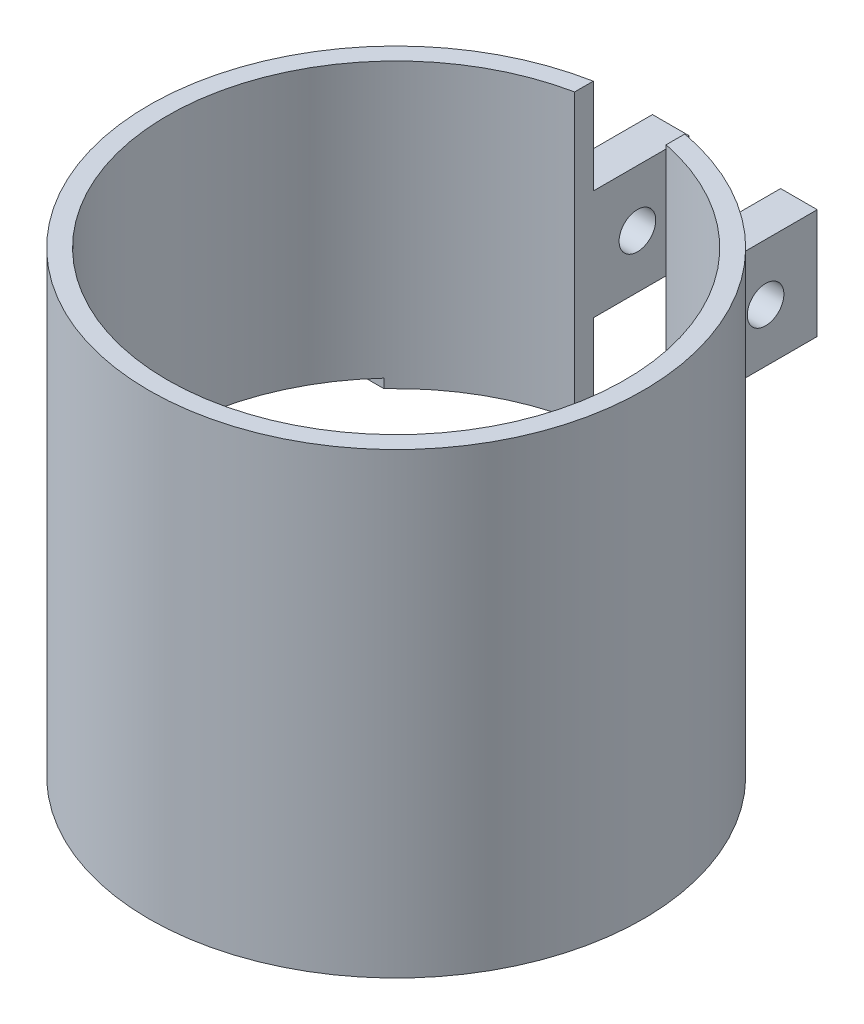
ISO-10303-21;
HEADER;
FILE_DESCRIPTION(('STEP AP214'),'2;1');
FILE_NAME('part.step','',(''),(''),'','','');
FILE_SCHEMA(('AUTOMOTIVE_DESIGN { 1 0 10303 214 1 1 1 1 }'));
ENDSEC;
DATA;
#1=APPLICATION_CONTEXT('core data for automotive mechanical design processes');
#2=APPLICATION_PROTOCOL_DEFINITION('international standard','automotive_design',2000,#1);
#3=PRODUCT_CONTEXT('',#1,'mechanical');
#4=PRODUCT('Part','Part','',(#3));
#5=PRODUCT_RELATED_PRODUCT_CATEGORY('part','',(#4));
#6=PRODUCT_DEFINITION_FORMATION('','',#4);
#7=PRODUCT_DEFINITION_CONTEXT('part definition',#1,'design');
#8=PRODUCT_DEFINITION('design','',#6,#7);
#9=PRODUCT_DEFINITION_SHAPE('','',#8);
#10=(LENGTH_UNIT() NAMED_UNIT(*) SI_UNIT(.MILLI.,.METRE.));
#11=(NAMED_UNIT(*) PLANE_ANGLE_UNIT() SI_UNIT($,.RADIAN.));
#12=(NAMED_UNIT(*) SI_UNIT($,.STERADIAN.) SOLID_ANGLE_UNIT());
#13=UNCERTAINTY_MEASURE_WITH_UNIT(LENGTH_MEASURE(1.E-05),#10,'distance_accuracy_value','');
#14=(GEOMETRIC_REPRESENTATION_CONTEXT(3) GLOBAL_UNCERTAINTY_ASSIGNED_CONTEXT((#13)) GLOBAL_UNIT_ASSIGNED_CONTEXT((#10,
#11,#12)) REPRESENTATION_CONTEXT('',''));
#15=CARTESIAN_POINT('',(0.,0.,0.));
#16=DIRECTION('',(0.,0.,1.));
#17=DIRECTION('',(1.,0.,0.));
#18=AXIS2_PLACEMENT_3D('',#15,#16,#17);
#19=CARTESIAN_POINT('',(0.,25.,0.));
#20=DIRECTION('',(0.,-1.,0.));
#21=DIRECTION('',(0.,0.,-1.));
#22=AXIS2_PLACEMENT_3D('',#19,#20,#21);
#23=CYLINDRICAL_SURFACE('',#22,13.5);
#24=CARTESIAN_POINT('',(0.,0.,0.));
#25=DIRECTION('',(0.,1.,0.));
#26=DIRECTION('',(0.,0.,1.));
#27=AXIS2_PLACEMENT_3D('',#24,#25,#26);
#28=CIRCLE('',#27,13.5);
#29=CARTESIAN_POINT('',(0.,0.,13.5));
#30=VERTEX_POINT('',#29);
#31=EDGE_CURVE('E283',#30,#30,#28,.T.);
#32=ORIENTED_EDGE('',*,*,#31,.T.);
#33=EDGE_LOOP('',(#32));
#34=FACE_BOUND('',#33,.T.);
#35=CARTESIAN_POINT('',(0.,19.8029275901374,0.));
#36=DIRECTION('',(0.,-1.,0.));
#37=DIRECTION('',(0.,0.,-1.));
#38=AXIS2_PLACEMENT_3D('',#35,#36,#37);
#39=CIRCLE('',#38,13.5);
#40=CARTESIAN_POINT('',(2.5,19.8029275901374,-13.2664991614216));
#41=VERTEX_POINT('',#40);
#42=CARTESIAN_POINT('',(4.5,19.8029275901374,-12.7279220613579));
#43=VERTEX_POINT('',#42);
#44=EDGE_CURVE('E52',#41,#43,#39,.T.);
#45=ORIENTED_EDGE('',*,*,#44,.F.);
#46=DIRECTION('',(0.,-1.,0.));
#47=VECTOR('',#46,1.);
#48=CARTESIAN_POINT('',(2.5,25.,-13.2664991614216));
#49=LINE('',#48,#47);
#50=CARTESIAN_POINT('',(2.50000000000001,25.,-13.2664991614216));
#51=VERTEX_POINT('',#50);
#52=EDGE_CURVE('E163',#41,#51,#49,.F.);
#53=ORIENTED_EDGE('',*,*,#52,.T.);
#54=CARTESIAN_POINT('',(0.,25.,0.));
#55=DIRECTION('',(0.,1.,0.));
#56=DIRECTION('',(0.,0.,1.));
#57=AXIS2_PLACEMENT_3D('',#54,#55,#56);
#58=CIRCLE('',#57,13.5);
#59=CARTESIAN_POINT('',(-2.49999999999999,25.,-13.2664991614216));
#60=VERTEX_POINT('',#59);
#61=EDGE_CURVE('E286',#60,#51,#58,.T.);
#62=ORIENTED_EDGE('',*,*,#61,.F.);
#63=DIRECTION('',(0.,-1.,0.));
#64=VECTOR('',#63,1.);
#65=CARTESIAN_POINT('',(-2.49999999999999,25.,-13.2664991614216));
#66=LINE('',#65,#64);
#67=CARTESIAN_POINT('',(-2.49999999999999,19.8029275901374,-13.2664991614216));
#68=VERTEX_POINT('',#67);
#69=EDGE_CURVE('E254',#60,#68,#66,.T.);
#70=ORIENTED_EDGE('',*,*,#69,.T.);
#71=CARTESIAN_POINT('',(0.,19.8029275901374,0.));
#72=DIRECTION('',(0.,1.,0.));
#73=DIRECTION('',(0.,0.,1.));
#74=AXIS2_PLACEMENT_3D('',#71,#72,#73);
#75=CIRCLE('',#74,13.5);
#76=CARTESIAN_POINT('',(-4.5,19.8029275901374,-12.7279220613579));
#77=VERTEX_POINT('',#76);
#78=EDGE_CURVE('E217',#68,#77,#75,.T.);
#79=ORIENTED_EDGE('',*,*,#78,.T.);
#80=DIRECTION('',(0.,-1.,0.));
#81=VECTOR('',#80,1.);
#82=CARTESIAN_POINT('',(-4.5,25.,-12.7279220613579));
#83=LINE('',#82,#81);
#84=CARTESIAN_POINT('',(-4.5,13.8029275901374,-12.7279220613579));
#85=VERTEX_POINT('',#84);
#86=EDGE_CURVE('E227',#77,#85,#83,.T.);
#87=ORIENTED_EDGE('',*,*,#86,.T.);
#88=CARTESIAN_POINT('',(0.,13.8029275901374,0.));
#89=DIRECTION('',(0.,-1.,0.));
#90=DIRECTION('',(0.,0.,-1.));
#91=AXIS2_PLACEMENT_3D('',#88,#89,#90);
#92=CIRCLE('',#91,13.5);
#93=CARTESIAN_POINT('',(-2.5,13.8029275901374,-13.2664991614216));
#94=VERTEX_POINT('',#93);
#95=EDGE_CURVE('E224',#85,#94,#92,.T.);
#96=ORIENTED_EDGE('',*,*,#95,.T.);
#97=CARTESIAN_POINT('',(-2.5,9.5,-13.2664991614216));
#98=VERTEX_POINT('',#97);
#99=EDGE_CURVE('E253',#94,#98,#66,.T.);
#100=ORIENTED_EDGE('',*,*,#99,.T.);
#101=CARTESIAN_POINT('',(0.,9.5,0.));
#102=DIRECTION('',(0.,1.,0.));
#103=DIRECTION('',(-1.,0.,0.));
#104=AXIS2_PLACEMENT_3D('',#101,#102,#103);
#105=CIRCLE('',#104,13.5);
#106=CARTESIAN_POINT('',(-10.4880884817015,9.5,-8.50000000000001));
#107=VERTEX_POINT('',#106);
#108=EDGE_CURVE('E248',#98,#107,#105,.T.);
#109=ORIENTED_EDGE('',*,*,#108,.T.);
#110=DIRECTION('',(0.,-1.,0.));
#111=VECTOR('',#110,1.);
#112=CARTESIAN_POINT('',(-10.4880884817015,25.,-8.50000000000001));
#113=LINE('',#112,#111);
#114=CARTESIAN_POINT('',(-10.4880884817015,10.,-8.50000000000001));
#115=VERTEX_POINT('',#114);
#116=EDGE_CURVE('E270',#107,#115,#113,.F.);
#117=ORIENTED_EDGE('',*,*,#116,.T.);
#118=CARTESIAN_POINT('',(0.,10.,0.));
#119=DIRECTION('',(0.,1.,0.));
#120=DIRECTION('',(0.,0.,1.));
#121=AXIS2_PLACEMENT_3D('',#118,#119,#120);
#122=CIRCLE('',#121,13.5);
#123=CARTESIAN_POINT('',(-10.4880884817015,10.,8.5));
#124=VERTEX_POINT('',#123);
#125=EDGE_CURVE('E260',#115,#124,#122,.T.);
#126=ORIENTED_EDGE('',*,*,#125,.T.);
#127=DIRECTION('',(0.,-1.,0.));
#128=VECTOR('',#127,1.);
#129=CARTESIAN_POINT('',(-10.4880884817015,25.,8.5));
#130=LINE('',#129,#128);
#131=CARTESIAN_POINT('',(-10.4880884817015,2.,8.5));
#132=VERTEX_POINT('',#131);
#133=EDGE_CURVE('E276',#124,#132,#130,.T.);
#134=ORIENTED_EDGE('',*,*,#133,.T.);
#135=CARTESIAN_POINT('',(0.,2.,0.));
#136=DIRECTION('',(0.,-1.,0.));
#137=DIRECTION('',(0.,0.,-1.));
#138=AXIS2_PLACEMENT_3D('',#135,#136,#137);
#139=CIRCLE('',#138,13.5);
#140=CARTESIAN_POINT('',(-10.4880884817015,2.,-8.5));
#141=VERTEX_POINT('',#140);
#142=EDGE_CURVE('E274',#132,#141,#139,.T.);
#143=ORIENTED_EDGE('',*,*,#142,.T.);
#144=CARTESIAN_POINT('',(-10.4880884817015,6.5,-8.50000000000001));
#145=VERTEX_POINT('',#144);
#146=EDGE_CURVE('E271',#141,#145,#113,.F.);
#147=ORIENTED_EDGE('',*,*,#146,.T.);
#148=CARTESIAN_POINT('',(0.,6.5,0.));
#149=DIRECTION('',(0.,-1.,0.));
#150=DIRECTION('',(1.,0.,0.));
#151=AXIS2_PLACEMENT_3D('',#148,#149,#150);
#152=CIRCLE('',#151,13.5);
#153=CARTESIAN_POINT('',(2.5,6.5,-13.2664991614216));
#154=VERTEX_POINT('',#153);
#155=EDGE_CURVE('E243',#145,#154,#152,.T.);
#156=ORIENTED_EDGE('',*,*,#155,.T.);
#157=CARTESIAN_POINT('',(2.5,13.8029275901374,-13.2664991614216));
#158=VERTEX_POINT('',#157);
#159=EDGE_CURVE('E251',#154,#158,#49,.F.);
#160=ORIENTED_EDGE('',*,*,#159,.T.);
#161=CARTESIAN_POINT('',(0.,13.8029275901374,0.));
#162=DIRECTION('',(0.,1.,0.));
#163=DIRECTION('',(0.,0.,1.));
#164=AXIS2_PLACEMENT_3D('',#161,#162,#163);
#165=CIRCLE('',#164,13.5);
#166=CARTESIAN_POINT('',(4.5,13.8029275901374,-12.7279220613579));
#167=VERTEX_POINT('',#166);
#168=EDGE_CURVE('E190',#167,#158,#165,.T.);
#169=ORIENTED_EDGE('',*,*,#168,.F.);
#170=DIRECTION('',(0.,-1.,0.));
#171=VECTOR('',#170,1.);
#172=CARTESIAN_POINT('',(4.5,25.,-12.7279220613579));
#173=LINE('',#172,#171);
#174=EDGE_CURVE('E48',#43,#167,#173,.T.);
#175=ORIENTED_EDGE('',*,*,#174,.F.);
#176=EDGE_LOOP('',(#45,#53,#62,#70,#79,#87,#96,#100,#109,#117,#126,#134,#143,#147,#156,#160,
#169,#175));
#177=FACE_BOUND('',#176,.T.);
#178=ADVANCED_FACE('F34',(#34,#177),#23,.T.);
#179=CARTESIAN_POINT('',(-4.50000000000001,2.,-8.5));
#180=DIRECTION('',(0.,0.,-1.));
#181=DIRECTION('',(0.,1.,0.));
#182=AXIS2_PLACEMENT_3D('',#179,#180,#181);
#183=PLANE('',#182);
#184=ORIENTED_EDGE('',*,*,#116,.F.);
#185=DIRECTION('',(1.,0.,0.));
#186=VECTOR('',#185,1.);
#187=CARTESIAN_POINT('',(-4.50000000000001,9.5,-8.50000000000001));
#188=LINE('',#187,#186);
#189=CARTESIAN_POINT('',(-9.16515138991168,9.5,-8.5));
#190=VERTEX_POINT('',#189);
#191=EDGE_CURVE('E307',#107,#190,#188,.T.);
#192=ORIENTED_EDGE('',*,*,#191,.T.);
#193=DIRECTION('',(0.,1.,0.));
#194=VECTOR('',#193,1.);
#195=CARTESIAN_POINT('',(-9.16515138991168,0.999999999999999,-8.5));
#196=LINE('',#195,#194);
#197=CARTESIAN_POINT('',(-9.16515138991168,10.,-8.50000000000001));
#198=VERTEX_POINT('',#197);
#199=EDGE_CURVE('E295',#198,#190,#196,.F.);
#200=ORIENTED_EDGE('',*,*,#199,.F.);
#201=DIRECTION('',(-1.,0.,0.));
#202=VECTOR('',#201,1.);
#203=CARTESIAN_POINT('',(-4.50000000000001,10.,-8.50000000000001));
#204=LINE('',#203,#202);
#205=EDGE_CURVE('E264',#198,#115,#204,.T.);
#206=ORIENTED_EDGE('',*,*,#205,.T.);
#207=EDGE_LOOP('',(#184,#192,#200,#206));
#208=FACE_BOUND('',#207,.T.);
#209=ADVANCED_FACE('F339',(#208),#183,.F.);
#210=CARTESIAN_POINT('',(0.,25.,0.));
#211=DIRECTION('',(0.,1.,0.));
#212=DIRECTION('',(0.,0.,1.));
#213=AXIS2_PLACEMENT_3D('',#210,#211,#212);
#214=PLANE('',#213);
#215=DIRECTION('',(0.,0.,-1.));
#216=VECTOR('',#215,1.);
#217=CARTESIAN_POINT('',(-2.49999999999999,25.,-4.50000000000001));
#218=LINE('',#217,#216);
#219=CARTESIAN_POINT('',(-2.49999999999999,25.,-12.2474487139159));
#220=VERTEX_POINT('',#219);
#221=EDGE_CURVE('E229',#220,#60,#218,.T.);
#222=ORIENTED_EDGE('',*,*,#221,.T.);
#223=ORIENTED_EDGE('',*,*,#61,.T.);
#224=DIRECTION('',(0.,0.,-1.));
#225=VECTOR('',#224,1.);
#226=CARTESIAN_POINT('',(2.50000000000001,25.,-4.50000000000001));
#227=LINE('',#226,#225);
#228=CARTESIAN_POINT('',(2.50000000000001,25.,-12.2474487139159));
#229=VERTEX_POINT('',#228);
#230=EDGE_CURVE('E237',#229,#51,#227,.T.);
#231=ORIENTED_EDGE('',*,*,#230,.F.);
#232=CARTESIAN_POINT('',(0.,25.,0.));
#233=DIRECTION('',(0.,1.,0.));
#234=DIRECTION('',(0.,0.,1.));
#235=AXIS2_PLACEMENT_3D('',#232,#233,#234);
#236=CIRCLE('',#235,12.5);
#237=EDGE_CURVE('E279',#220,#229,#236,.T.);
#238=ORIENTED_EDGE('',*,*,#237,.F.);
#239=EDGE_LOOP('',(#222,#223,#231,#238));
#240=FACE_BOUND('',#239,.T.);
#241=ADVANCED_FACE('F344',(#240),#214,.T.);
#242=CARTESIAN_POINT('',(0.,0.,0.));
#243=DIRECTION('',(0.,1.,0.));
#244=DIRECTION('',(0.,0.,1.));
#245=AXIS2_PLACEMENT_3D('',#242,#243,#244);
#246=PLANE('',#245);
#247=ORIENTED_EDGE('',*,*,#31,.F.);
#248=EDGE_LOOP('',(#247));
#249=FACE_BOUND('',#248,.T.);
#250=ADVANCED_FACE('F350',(#249),#246,.F.);
#251=CARTESIAN_POINT('',(0.,1.,0.));
#252=DIRECTION('',(0.,1.,0.));
#253=DIRECTION('',(0.,0.,1.));
#254=AXIS2_PLACEMENT_3D('',#251,#252,#253);
#255=CYLINDRICAL_SURFACE('',#254,12.5);
#256=DIRECTION('',(0.,1.,0.));
#257=VECTOR('',#256,1.);
#258=CARTESIAN_POINT('',(2.5,1.,-12.2474487139159));
#259=LINE('',#258,#257);
#260=CARTESIAN_POINT('',(2.5,6.5,-12.2474487139159));
#261=VERTEX_POINT('',#260);
#262=EDGE_CURVE('E41',#229,#261,#259,.F.);
#263=ORIENTED_EDGE('',*,*,#262,.T.);
#264=CARTESIAN_POINT('',(0.,6.5,0.));
#265=DIRECTION('',(0.,-1.,0.));
#266=DIRECTION('',(1.,0.,0.));
#267=AXIS2_PLACEMENT_3D('',#264,#265,#266);
#268=CIRCLE('',#267,12.5);
#269=CARTESIAN_POINT('',(-9.16515138991168,6.5,-8.50000000000001));
#270=VERTEX_POINT('',#269);
#271=EDGE_CURVE('E233',#261,#270,#268,.F.);
#272=ORIENTED_EDGE('',*,*,#271,.T.);
#273=CARTESIAN_POINT('',(-9.16515138991168,2.,-8.5));
#274=VERTEX_POINT('',#273);
#275=EDGE_CURVE('E294',#270,#274,#196,.F.);
#276=ORIENTED_EDGE('',*,*,#275,.T.);
#277=CARTESIAN_POINT('',(0.,2.,0.));
#278=DIRECTION('',(0.,-1.,0.));
#279=DIRECTION('',(0.,0.,-1.));
#280=AXIS2_PLACEMENT_3D('',#277,#278,#279);
#281=CIRCLE('',#280,12.5);
#282=CARTESIAN_POINT('',(-9.16515138991169,2.,8.5));
#283=VERTEX_POINT('',#282);
#284=EDGE_CURVE('E298',#274,#283,#281,.F.);
#285=ORIENTED_EDGE('',*,*,#284,.T.);
#286=DIRECTION('',(0.,1.,0.));
#287=VECTOR('',#286,1.);
#288=CARTESIAN_POINT('',(-9.16515138991169,0.999999999999999,8.5));
#289=LINE('',#288,#287);
#290=CARTESIAN_POINT('',(-9.16515138991169,10.,8.5));
#291=VERTEX_POINT('',#290);
#292=EDGE_CURVE('E301',#283,#291,#289,.T.);
#293=ORIENTED_EDGE('',*,*,#292,.T.);
#294=CARTESIAN_POINT('',(0.,10.,0.));
#295=DIRECTION('',(0.,1.,0.));
#296=DIRECTION('',(0.,0.,1.));
#297=AXIS2_PLACEMENT_3D('',#294,#295,#296);
#298=CIRCLE('',#297,12.5);
#299=EDGE_CURVE('E289',#291,#198,#298,.F.);
#300=ORIENTED_EDGE('',*,*,#299,.T.);
#301=ORIENTED_EDGE('',*,*,#199,.T.);
#302=CARTESIAN_POINT('',(0.,9.5,0.));
#303=DIRECTION('',(0.,1.,0.));
#304=DIRECTION('',(-1.,0.,0.));
#305=AXIS2_PLACEMENT_3D('',#302,#303,#304);
#306=CIRCLE('',#305,12.5);
#307=CARTESIAN_POINT('',(-2.5,9.5,-12.2474487139159));
#308=VERTEX_POINT('',#307);
#309=EDGE_CURVE('E245',#190,#308,#306,.F.);
#310=ORIENTED_EDGE('',*,*,#309,.T.);
#311=DIRECTION('',(0.,1.,0.));
#312=VECTOR('',#311,1.);
#313=CARTESIAN_POINT('',(-2.5,1.,-12.2474487139159));
#314=LINE('',#313,#312);
#315=EDGE_CURVE('E11',#308,#220,#314,.T.);
#316=ORIENTED_EDGE('',*,*,#315,.T.);
#317=ORIENTED_EDGE('',*,*,#237,.T.);
#318=EDGE_LOOP('',(#263,#272,#276,#285,#293,#300,#301,#310,#316,#317));
#319=FACE_BOUND('',#318,.T.);
#320=CARTESIAN_POINT('',(0.,1.,0.));
#321=DIRECTION('',(0.,1.,0.));
#322=DIRECTION('',(0.,0.,1.));
#323=AXIS2_PLACEMENT_3D('',#320,#321,#322);
#324=CIRCLE('',#323,12.5);
#325=CARTESIAN_POINT('',(0.,1.,12.5));
#326=VERTEX_POINT('',#325);
#327=EDGE_CURVE('E280',#326,#326,#324,.T.);
#328=ORIENTED_EDGE('',*,*,#327,.F.);
#329=EDGE_LOOP('',(#328));
#330=FACE_BOUND('',#329,.T.);
#331=ADVANCED_FACE('F311',(#319,#330),#255,.F.);
#332=CARTESIAN_POINT('',(0.,1.,0.));
#333=DIRECTION('',(0.,1.,0.));
#334=DIRECTION('',(0.,0.,1.));
#335=AXIS2_PLACEMENT_3D('',#332,#333,#334);
#336=PLANE('',#335);
#337=ORIENTED_EDGE('',*,*,#327,.T.);
#338=EDGE_LOOP('',(#337));
#339=FACE_BOUND('',#338,.T.);
#340=ADVANCED_FACE('F356',(#339),#336,.T.);
#341=CARTESIAN_POINT('',(-4.50000000000001,2.,8.5));
#342=DIRECTION('',(0.,0.,1.));
#343=DIRECTION('',(0.,-1.,0.));
#344=AXIS2_PLACEMENT_3D('',#341,#342,#343);
#345=PLANE('',#344);
#346=DIRECTION('',(-1.,0.,0.));
#347=VECTOR('',#346,1.);
#348=CARTESIAN_POINT('',(-4.50000000000001,10.,8.5));
#349=LINE('',#348,#347);
#350=EDGE_CURVE('E256',#291,#124,#349,.T.);
#351=ORIENTED_EDGE('',*,*,#350,.F.);
#352=ORIENTED_EDGE('',*,*,#292,.F.);
#353=DIRECTION('',(-1.,0.,0.));
#354=VECTOR('',#353,1.);
#355=CARTESIAN_POINT('',(-4.50000000000001,2.,8.5));
#356=LINE('',#355,#354);
#357=EDGE_CURVE('E257',#283,#132,#356,.T.);
#358=ORIENTED_EDGE('',*,*,#357,.T.);
#359=ORIENTED_EDGE('',*,*,#133,.F.);
#360=EDGE_LOOP('',(#351,#352,#358,#359));
#361=FACE_BOUND('',#360,.T.);
#362=ADVANCED_FACE('F363',(#361),#345,.F.);
#363=CARTESIAN_POINT('',(-4.50000000000001,2.,-8.5));
#364=DIRECTION('',(0.,-1.,0.));
#365=DIRECTION('',(0.,0.,-1.));
#366=AXIS2_PLACEMENT_3D('',#363,#364,#365);
#367=PLANE('',#366);
#368=ORIENTED_EDGE('',*,*,#357,.F.);
#369=ORIENTED_EDGE('',*,*,#284,.F.);
#370=DIRECTION('',(-1.,0.,0.));
#371=VECTOR('',#370,1.);
#372=CARTESIAN_POINT('',(-4.50000000000001,2.,-8.5));
#373=LINE('',#372,#371);
#374=EDGE_CURVE('E261',#274,#141,#373,.T.);
#375=ORIENTED_EDGE('',*,*,#374,.T.);
#376=ORIENTED_EDGE('',*,*,#142,.F.);
#377=EDGE_LOOP('',(#368,#369,#375,#376));
#378=FACE_BOUND('',#377,.T.);
#379=ADVANCED_FACE('F367',(#378),#367,.F.);
#380=ORIENTED_EDGE('',*,*,#275,.F.);
#381=DIRECTION('',(-1.,0.,0.));
#382=VECTOR('',#381,1.);
#383=CARTESIAN_POINT('',(-4.50000000000001,6.5,-8.50000000000001));
#384=LINE('',#383,#382);
#385=EDGE_CURVE('E304',#270,#145,#384,.T.);
#386=ORIENTED_EDGE('',*,*,#385,.T.);
#387=ORIENTED_EDGE('',*,*,#146,.F.);
#388=ORIENTED_EDGE('',*,*,#374,.F.);
#389=EDGE_LOOP('',(#380,#386,#387,#388));
#390=FACE_BOUND('',#389,.T.);
#391=ADVANCED_FACE('F347',(#390),#183,.F.);
#392=CARTESIAN_POINT('',(-4.50000000000001,10.,-8.50000000000001));
#393=DIRECTION('',(0.,1.,0.));
#394=DIRECTION('',(0.,0.,1.));
#395=AXIS2_PLACEMENT_3D('',#392,#393,#394);
#396=PLANE('',#395);
#397=ORIENTED_EDGE('',*,*,#205,.F.);
#398=ORIENTED_EDGE('',*,*,#299,.F.);
#399=ORIENTED_EDGE('',*,*,#350,.T.);
#400=ORIENTED_EDGE('',*,*,#125,.F.);
#401=EDGE_LOOP('',(#397,#398,#399,#400));
#402=FACE_BOUND('',#401,.T.);
#403=ADVANCED_FACE('F369',(#402),#396,.F.);
#404=CARTESIAN_POINT('',(-10.5,6.5,-4.50000000000001));
#405=DIRECTION('',(0.,-1.,0.));
#406=DIRECTION('',(1.,0.,0.));
#407=AXIS2_PLACEMENT_3D('',#404,#405,#406);
#408=PLANE('',#407);
#409=ORIENTED_EDGE('',*,*,#155,.F.);
#410=ORIENTED_EDGE('',*,*,#385,.F.);
#411=ORIENTED_EDGE('',*,*,#271,.F.);
#412=DIRECTION('',(0.,0.,-1.));
#413=VECTOR('',#412,1.);
#414=CARTESIAN_POINT('',(2.5,6.5,-4.50000000000001));
#415=LINE('',#414,#413);
#416=EDGE_CURVE('E234',#261,#154,#415,.T.);
#417=ORIENTED_EDGE('',*,*,#416,.T.);
#418=EDGE_LOOP('',(#409,#410,#411,#417));
#419=FACE_BOUND('',#418,.T.);
#420=ADVANCED_FACE('F317',(#419),#408,.F.);
#421=CARTESIAN_POINT('',(2.5,9.5,-4.50000000000001));
#422=DIRECTION('',(1.,0.,0.));
#423=DIRECTION('',(0.,0.,-1.));
#424=AXIS2_PLACEMENT_3D('',#421,#422,#423);
#425=PLANE('',#424);
#426=CARTESIAN_POINT('',(2.5,16.7205559801136,-15.6779042610197));
#427=DIRECTION('',(1.,0.,0.));
#428=DIRECTION('',(0.,1.,0.));
#429=AXIS2_PLACEMENT_3D('',#426,#427,#428);
#430=CIRCLE('',#429,1.);
#431=CARTESIAN_POINT('',(2.5,17.7205559801136,-15.6779042610197));
#432=VERTEX_POINT('',#431);
#433=EDGE_CURVE('E421',#432,#432,#430,.T.);
#434=ORIENTED_EDGE('',*,*,#433,.T.);
#435=EDGE_LOOP('',(#434));
#436=FACE_BOUND('',#435,.T.);
#437=ORIENTED_EDGE('',*,*,#416,.F.);
#438=ORIENTED_EDGE('',*,*,#262,.F.);
#439=ORIENTED_EDGE('',*,*,#230,.T.);
#440=ORIENTED_EDGE('',*,*,#52,.F.);
#441=DIRECTION('',(0.,0.,-1.));
#442=VECTOR('',#441,1.);
#443=CARTESIAN_POINT('',(2.5,19.8029275901374,13.501));
#444=LINE('',#443,#442);
#445=CARTESIAN_POINT('',(2.5,19.8029275901374,-18.5));
#446=VERTEX_POINT('',#445);
#447=EDGE_CURVE('E155',#41,#446,#444,.T.);
#448=ORIENTED_EDGE('',*,*,#447,.T.);
#449=DIRECTION('',(0.,-1.,0.));
#450=VECTOR('',#449,1.);
#451=CARTESIAN_POINT('',(2.5,19.8029275901374,-18.5));
#452=LINE('',#451,#450);
#453=CARTESIAN_POINT('',(2.5,13.8029275901374,-18.5));
#454=VERTEX_POINT('',#453);
#455=EDGE_CURVE('E160',#446,#454,#452,.T.);
#456=ORIENTED_EDGE('',*,*,#455,.T.);
#457=DIRECTION('',(0.,0.,-1.));
#458=VECTOR('',#457,1.);
#459=CARTESIAN_POINT('',(2.5,13.8029275901374,13.501));
#460=LINE('',#459,#458);
#461=EDGE_CURVE('E186',#158,#454,#460,.T.);
#462=ORIENTED_EDGE('',*,*,#461,.F.);
#463=ORIENTED_EDGE('',*,*,#159,.F.);
#464=EDGE_LOOP('',(#437,#438,#439,#440,#448,#456,#462,#463));
#465=FACE_BOUND('',#464,.T.);
#466=ADVANCED_FACE('F158',(#436,#465),#425,.F.);
#467=CARTESIAN_POINT('',(-2.49999999999999,25.,-4.50000000000001));
#468=DIRECTION('',(-1.,0.,0.));
#469=DIRECTION('',(0.,-1.,0.));
#470=AXIS2_PLACEMENT_3D('',#467,#468,#469);
#471=PLANE('',#470);
#472=CARTESIAN_POINT('',(-2.5,16.7205559801136,-15.6779042610197));
#473=DIRECTION('',(1.,0.,0.));
#474=DIRECTION('',(0.,1.,0.));
#475=AXIS2_PLACEMENT_3D('',#472,#473,#474);
#476=CIRCLE('',#475,1.);
#477=CARTESIAN_POINT('',(-2.5,17.7205559801136,-15.6779042610197));
#478=VERTEX_POINT('',#477);
#479=EDGE_CURVE('E196',#478,#478,#476,.T.);
#480=ORIENTED_EDGE('',*,*,#479,.F.);
#481=EDGE_LOOP('',(#480));
#482=FACE_BOUND('',#481,.T.);
#483=ORIENTED_EDGE('',*,*,#221,.F.);
#484=ORIENTED_EDGE('',*,*,#315,.F.);
#485=DIRECTION('',(0.,0.,-1.));
#486=VECTOR('',#485,1.);
#487=CARTESIAN_POINT('',(-2.5,9.5,-4.50000000000001));
#488=LINE('',#487,#486);
#489=EDGE_CURVE('E230',#308,#98,#488,.T.);
#490=ORIENTED_EDGE('',*,*,#489,.T.);
#491=ORIENTED_EDGE('',*,*,#99,.F.);
#492=DIRECTION('',(0.,0.,-1.));
#493=VECTOR('',#492,1.);
#494=CARTESIAN_POINT('',(-2.5,13.8029275901374,13.501));
#495=LINE('',#494,#493);
#496=CARTESIAN_POINT('',(-2.5,13.8029275901374,-18.5));
#497=VERTEX_POINT('',#496);
#498=EDGE_CURVE('E214',#94,#497,#495,.T.);
#499=ORIENTED_EDGE('',*,*,#498,.T.);
#500=DIRECTION('',(0.,-1.,0.));
#501=VECTOR('',#500,1.);
#502=CARTESIAN_POINT('',(-2.5,19.8029275901374,-18.5));
#503=LINE('',#502,#501);
#504=CARTESIAN_POINT('',(-2.5,19.8029275901374,-18.5));
#505=VERTEX_POINT('',#504);
#506=EDGE_CURVE('E202',#505,#497,#503,.T.);
#507=ORIENTED_EDGE('',*,*,#506,.F.);
#508=DIRECTION('',(0.,0.,-1.));
#509=VECTOR('',#508,1.);
#510=CARTESIAN_POINT('',(-2.5,19.8029275901374,13.501));
#511=LINE('',#510,#509);
#512=EDGE_CURVE('E215',#68,#505,#511,.T.);
#513=ORIENTED_EDGE('',*,*,#512,.F.);
#514=ORIENTED_EDGE('',*,*,#69,.F.);
#515=EDGE_LOOP('',(#483,#484,#490,#491,#499,#507,#513,#514));
#516=FACE_BOUND('',#515,.T.);
#517=ADVANCED_FACE('F378',(#482,#516),#471,.F.);
#518=CARTESIAN_POINT('',(-10.5,9.5,-4.50000000000001));
#519=DIRECTION('',(0.,1.,0.));
#520=DIRECTION('',(-1.,0.,0.));
#521=AXIS2_PLACEMENT_3D('',#518,#519,#520);
#522=PLANE('',#521);
#523=ORIENTED_EDGE('',*,*,#489,.F.);
#524=ORIENTED_EDGE('',*,*,#309,.F.);
#525=ORIENTED_EDGE('',*,*,#191,.F.);
#526=ORIENTED_EDGE('',*,*,#108,.F.);
#527=EDGE_LOOP('',(#523,#524,#525,#526));
#528=FACE_BOUND('',#527,.T.);
#529=ADVANCED_FACE('F381',(#528),#522,.F.);
#530=CARTESIAN_POINT('',(-4.5,19.8029275901374,13.501));
#531=DIRECTION('',(-1.,0.,0.));
#532=DIRECTION('',(0.,0.,1.));
#533=AXIS2_PLACEMENT_3D('',#530,#531,#532);
#534=PLANE('',#533);
#535=CARTESIAN_POINT('',(-4.5,16.7205559801136,-15.6779042610197));
#536=DIRECTION('',(-1.,0.,0.));
#537=DIRECTION('',(0.,0.,1.));
#538=AXIS2_PLACEMENT_3D('',#535,#536,#537);
#539=CIRCLE('',#538,1.);
#540=CARTESIAN_POINT('',(-4.5,16.7205559801136,-14.6779042610197));
#541=VERTEX_POINT('',#540);
#542=EDGE_CURVE('E199',#541,#541,#539,.F.);
#543=ORIENTED_EDGE('',*,*,#542,.T.);
#544=EDGE_LOOP('',(#543));
#545=FACE_BOUND('',#544,.T.);
#546=ORIENTED_EDGE('',*,*,#86,.F.);
#547=DIRECTION('',(0.,0.,-1.));
#548=VECTOR('',#547,1.);
#549=CARTESIAN_POINT('',(-4.5,19.8029275901374,13.501));
#550=LINE('',#549,#548);
#551=CARTESIAN_POINT('',(-4.5,19.8029275901374,-18.5));
#552=VERTEX_POINT('',#551);
#553=EDGE_CURVE('E218',#77,#552,#550,.T.);
#554=ORIENTED_EDGE('',*,*,#553,.T.);
#555=DIRECTION('',(0.,1.,0.));
#556=VECTOR('',#555,1.);
#557=CARTESIAN_POINT('',(-4.5,19.8029275901374,-18.5));
#558=LINE('',#557,#556);
#559=CARTESIAN_POINT('',(-4.5,13.8029275901374,-18.5));
#560=VERTEX_POINT('',#559);
#561=EDGE_CURVE('E208',#560,#552,#558,.T.);
#562=ORIENTED_EDGE('',*,*,#561,.F.);
#563=DIRECTION('',(0.,0.,-1.));
#564=VECTOR('',#563,1.);
#565=CARTESIAN_POINT('',(-4.5,13.8029275901374,13.501));
#566=LINE('',#565,#564);
#567=EDGE_CURVE('E220',#85,#560,#566,.T.);
#568=ORIENTED_EDGE('',*,*,#567,.F.);
#569=EDGE_LOOP('',(#546,#554,#562,#568));
#570=FACE_BOUND('',#569,.T.);
#571=ADVANCED_FACE('F390',(#545,#570),#534,.T.);
#572=CARTESIAN_POINT('',(-4.5,13.8029275901374,13.501));
#573=DIRECTION('',(0.,-1.,0.));
#574=DIRECTION('',(0.,0.,-1.));
#575=AXIS2_PLACEMENT_3D('',#572,#573,#574);
#576=PLANE('',#575);
#577=ORIENTED_EDGE('',*,*,#95,.F.);
#578=ORIENTED_EDGE('',*,*,#567,.T.);
#579=DIRECTION('',(-1.,0.,0.));
#580=VECTOR('',#579,1.);
#581=CARTESIAN_POINT('',(-4.5,13.8029275901374,-18.5));
#582=LINE('',#581,#580);
#583=EDGE_CURVE('E205',#497,#560,#582,.T.);
#584=ORIENTED_EDGE('',*,*,#583,.F.);
#585=ORIENTED_EDGE('',*,*,#498,.F.);
#586=EDGE_LOOP('',(#577,#578,#584,#585));
#587=FACE_BOUND('',#586,.T.);
#588=ADVANCED_FACE('F392',(#587),#576,.T.);
#589=CARTESIAN_POINT('',(-4.5,19.8029275901374,13.501));
#590=DIRECTION('',(0.,1.,0.));
#591=DIRECTION('',(0.,0.,1.));
#592=AXIS2_PLACEMENT_3D('',#589,#590,#591);
#593=PLANE('',#592);
#594=ORIENTED_EDGE('',*,*,#78,.F.);
#595=ORIENTED_EDGE('',*,*,#512,.T.);
#596=DIRECTION('',(1.,0.,0.));
#597=VECTOR('',#596,1.);
#598=CARTESIAN_POINT('',(-4.5,19.8029275901374,-18.5));
#599=LINE('',#598,#597);
#600=EDGE_CURVE('E211',#552,#505,#599,.T.);
#601=ORIENTED_EDGE('',*,*,#600,.F.);
#602=ORIENTED_EDGE('',*,*,#553,.F.);
#603=EDGE_LOOP('',(#594,#595,#601,#602));
#604=FACE_BOUND('',#603,.T.);
#605=ADVANCED_FACE('F395',(#604),#593,.T.);
#606=CARTESIAN_POINT('',(0.,0.,-18.5));
#607=DIRECTION('',(0.,0.,1.));
#608=DIRECTION('',(1.,0.,0.));
#609=AXIS2_PLACEMENT_3D('',#606,#607,#608);
#610=PLANE('',#609);
#611=ORIENTED_EDGE('',*,*,#506,.T.);
#612=ORIENTED_EDGE('',*,*,#583,.T.);
#613=ORIENTED_EDGE('',*,*,#561,.T.);
#614=ORIENTED_EDGE('',*,*,#600,.T.);
#615=EDGE_LOOP('',(#611,#612,#613,#614));
#616=FACE_BOUND('',#615,.T.);
#617=ADVANCED_FACE('F333',(#616),#610,.F.);
#618=CARTESIAN_POINT('',(-7.32842712474619,16.7205559801136,-15.6779042610197));
#619=DIRECTION('',(1.,0.,0.));
#620=DIRECTION('',(0.,1.,0.));
#621=AXIS2_PLACEMENT_3D('',#618,#619,#620);
#622=CYLINDRICAL_SURFACE('',#621,1.);
#623=ORIENTED_EDGE('',*,*,#479,.T.);
#624=EDGE_LOOP('',(#623));
#625=FACE_BOUND('',#624,.T.);
#626=ORIENTED_EDGE('',*,*,#542,.F.);
#627=EDGE_LOOP('',(#626));
#628=FACE_BOUND('',#627,.T.);
#629=ADVANCED_FACE('F325',(#625,#628),#622,.F.);
#630=CARTESIAN_POINT('',(4.5,19.8029275901374,13.501));
#631=DIRECTION('',(-1.,0.,0.));
#632=DIRECTION('',(0.,0.,1.));
#633=AXIS2_PLACEMENT_3D('',#630,#631,#632);
#634=PLANE('',#633);
#635=CARTESIAN_POINT('',(4.5,16.7205559801136,-15.6779042610197));
#636=DIRECTION('',(1.,0.,0.));
#637=DIRECTION('',(0.,0.,-1.));
#638=AXIS2_PLACEMENT_3D('',#635,#636,#637);
#639=CIRCLE('',#638,1.);
#640=CARTESIAN_POINT('',(4.5,16.7205559801136,-16.6779042610197));
#641=VERTEX_POINT('',#640);
#642=EDGE_CURVE('E176',#641,#641,#639,.T.);
#643=ORIENTED_EDGE('',*,*,#642,.F.);
#644=EDGE_LOOP('',(#643));
#645=FACE_BOUND('',#644,.T.);
#646=DIRECTION('',(0.,0.,-1.));
#647=VECTOR('',#646,1.);
#648=CARTESIAN_POINT('',(4.5,19.8029275901374,13.501));
#649=LINE('',#648,#647);
#650=CARTESIAN_POINT('',(4.5,19.8029275901374,-18.5));
#651=VERTEX_POINT('',#650);
#652=EDGE_CURVE('E166',#43,#651,#649,.T.);
#653=ORIENTED_EDGE('',*,*,#652,.F.);
#654=ORIENTED_EDGE('',*,*,#174,.T.);
#655=DIRECTION('',(0.,0.,-1.));
#656=VECTOR('',#655,1.);
#657=CARTESIAN_POINT('',(4.5,13.8029275901374,13.501));
#658=LINE('',#657,#656);
#659=CARTESIAN_POINT('',(4.5,13.8029275901374,-18.5));
#660=VERTEX_POINT('',#659);
#661=EDGE_CURVE('E188',#167,#660,#658,.T.);
#662=ORIENTED_EDGE('',*,*,#661,.T.);
#663=DIRECTION('',(0.,1.,0.));
#664=VECTOR('',#663,1.);
#665=CARTESIAN_POINT('',(4.5,19.8029275901374,-18.5));
#666=LINE('',#665,#664);
#667=EDGE_CURVE('E180',#660,#651,#666,.T.);
#668=ORIENTED_EDGE('',*,*,#667,.T.);
#669=EDGE_LOOP('',(#653,#654,#662,#668));
#670=FACE_BOUND('',#669,.T.);
#671=ADVANCED_FACE('F323',(#645,#670),#634,.F.);
#672=CARTESIAN_POINT('',(4.5,19.8029275901374,13.501));
#673=DIRECTION('',(0.,-1.,0.));
#674=DIRECTION('',(0.,0.,-1.));
#675=AXIS2_PLACEMENT_3D('',#672,#673,#674);
#676=PLANE('',#675);
#677=ORIENTED_EDGE('',*,*,#447,.F.);
#678=ORIENTED_EDGE('',*,*,#44,.T.);
#679=ORIENTED_EDGE('',*,*,#652,.T.);
#680=DIRECTION('',(-1.,0.,0.));
#681=VECTOR('',#680,1.);
#682=CARTESIAN_POINT('',(4.5,19.8029275901374,-18.5));
#683=LINE('',#682,#681);
#684=EDGE_CURVE('E173',#651,#446,#683,.T.);
#685=ORIENTED_EDGE('',*,*,#684,.T.);
#686=EDGE_LOOP('',(#677,#678,#679,#685));
#687=FACE_BOUND('',#686,.T.);
#688=ADVANCED_FACE('F178',(#687),#676,.F.);
#689=CARTESIAN_POINT('',(4.5,13.8029275901374,13.501));
#690=DIRECTION('',(0.,1.,0.));
#691=DIRECTION('',(0.,0.,1.));
#692=AXIS2_PLACEMENT_3D('',#689,#690,#691);
#693=PLANE('',#692);
#694=ORIENTED_EDGE('',*,*,#661,.F.);
#695=ORIENTED_EDGE('',*,*,#168,.T.);
#696=ORIENTED_EDGE('',*,*,#461,.T.);
#697=DIRECTION('',(1.,0.,0.));
#698=VECTOR('',#697,1.);
#699=CARTESIAN_POINT('',(4.5,13.8029275901374,-18.5));
#700=LINE('',#699,#698);
#701=EDGE_CURVE('E167',#454,#660,#700,.T.);
#702=ORIENTED_EDGE('',*,*,#701,.T.);
#703=EDGE_LOOP('',(#694,#695,#696,#702));
#704=FACE_BOUND('',#703,.T.);
#705=ADVANCED_FACE('F321',(#704),#693,.F.);
#706=CARTESIAN_POINT('',(0.,0.,-18.5));
#707=DIRECTION('',(0.,0.,1.));
#708=DIRECTION('',(-1.,0.,0.));
#709=AXIS2_PLACEMENT_3D('',#706,#707,#708);
#710=PLANE('',#709);
#711=ORIENTED_EDGE('',*,*,#455,.F.);
#712=ORIENTED_EDGE('',*,*,#684,.F.);
#713=ORIENTED_EDGE('',*,*,#667,.F.);
#714=ORIENTED_EDGE('',*,*,#701,.F.);
#715=EDGE_LOOP('',(#711,#712,#713,#714));
#716=FACE_BOUND('',#715,.T.);
#717=ADVANCED_FACE('F171',(#716),#710,.F.);
#718=CARTESIAN_POINT('',(12.3284271247462,16.7205559801136,-15.6779042610197));
#719=DIRECTION('',(-1.,0.,0.));
#720=DIRECTION('',(0.,-1.,0.));
#721=AXIS2_PLACEMENT_3D('',#718,#719,#720);
#722=CYLINDRICAL_SURFACE('',#721,1.);
#723=ORIENTED_EDGE('',*,*,#433,.F.);
#724=EDGE_LOOP('',(#723));
#725=FACE_BOUND('',#724,.T.);
#726=ORIENTED_EDGE('',*,*,#642,.T.);
#727=EDGE_LOOP('',(#726));
#728=FACE_BOUND('',#727,.T.);
#729=ADVANCED_FACE('F409',(#725,#728),#722,.F.);
#730=CLOSED_SHELL('',(#178,#209,#241,#250,#331,#340,#362,#379,#391,#403,#420,#466,#517,#529,
#571,#588,#605,#617,#629,#671,#688,#705,#717,#729));
#731=MANIFOLD_SOLID_BREP('B2',#730);
#732=ADVANCED_BREP_SHAPE_REPRESENTATION('',(#18,#731),#14);
#733=SHAPE_DEFINITION_REPRESENTATION(#9,#732);
ENDSEC;
END-ISO-10303-21;
